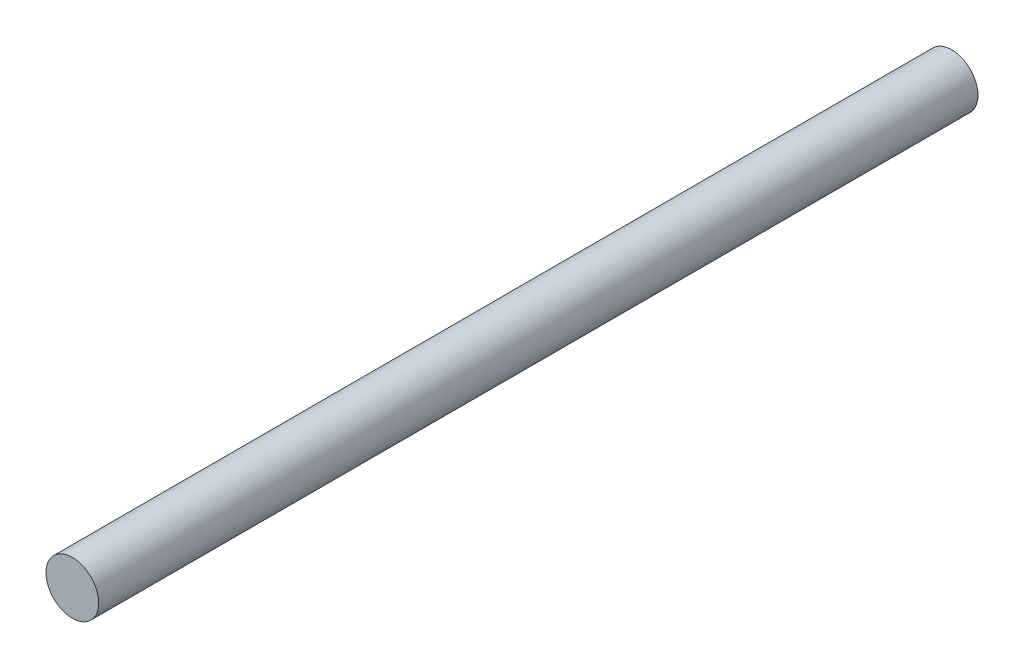
ISO-10303-21;
HEADER;
FILE_DESCRIPTION(('STEP AP214'),'2;1');
FILE_NAME('part.step','',(''),(''),'','','');
FILE_SCHEMA(('AUTOMOTIVE_DESIGN { 1 0 10303 214 1 1 1 1 }'));
ENDSEC;
DATA;
#1=APPLICATION_CONTEXT('core data for automotive mechanical design processes');
#2=APPLICATION_PROTOCOL_DEFINITION('international standard','automotive_design',2000,#1);
#3=PRODUCT_CONTEXT('',#1,'mechanical');
#4=PRODUCT('Part','Part','',(#3));
#5=PRODUCT_RELATED_PRODUCT_CATEGORY('part','',(#4));
#6=PRODUCT_DEFINITION_FORMATION('','',#4);
#7=PRODUCT_DEFINITION_CONTEXT('part definition',#1,'design');
#8=PRODUCT_DEFINITION('design','',#6,#7);
#9=PRODUCT_DEFINITION_SHAPE('','',#8);
#10=(LENGTH_UNIT() NAMED_UNIT(*) SI_UNIT(.MILLI.,.METRE.));
#11=(NAMED_UNIT(*) PLANE_ANGLE_UNIT() SI_UNIT($,.RADIAN.));
#12=(NAMED_UNIT(*) SI_UNIT($,.STERADIAN.) SOLID_ANGLE_UNIT());
#13=UNCERTAINTY_MEASURE_WITH_UNIT(LENGTH_MEASURE(1.E-05),#10,'distance_accuracy_value','');
#14=(GEOMETRIC_REPRESENTATION_CONTEXT(3) GLOBAL_UNCERTAINTY_ASSIGNED_CONTEXT((#13)) GLOBAL_UNIT_ASSIGNED_CONTEXT((#10,
#11,#12)) REPRESENTATION_CONTEXT('',''));
#15=CARTESIAN_POINT('',(0.,0.,0.));
#16=DIRECTION('',(0.,0.,1.));
#17=DIRECTION('',(1.,0.,0.));
#18=AXIS2_PLACEMENT_3D('',#15,#16,#17);
#19=CARTESIAN_POINT('',(0.,0.,1000.));
#20=DIRECTION('',(0.,0.,-1.));
#21=DIRECTION('',(-1.,0.,0.));
#22=AXIS2_PLACEMENT_3D('',#19,#20,#21);
#23=CYLINDRICAL_SURFACE('',#22,30.);
#24=CARTESIAN_POINT('',(0.,0.,1000.));
#25=DIRECTION('',(0.,0.,1.));
#26=DIRECTION('',(1.,0.,0.));
#27=AXIS2_PLACEMENT_3D('',#24,#25,#26);
#28=CIRCLE('',#27,30.);
#29=CARTESIAN_POINT('',(30.,0.,1000.));
#30=VERTEX_POINT('',#29);
#31=EDGE_CURVE('E10',#30,#30,#28,.T.);
#32=ORIENTED_EDGE('',*,*,#31,.F.);
#33=EDGE_LOOP('',(#32));
#34=FACE_BOUND('',#33,.T.);
#35=CARTESIAN_POINT('',(0.,0.,0.));
#36=DIRECTION('',(0.,0.,1.));
#37=DIRECTION('',(1.,0.,0.));
#38=AXIS2_PLACEMENT_3D('',#35,#36,#37);
#39=CIRCLE('',#38,30.);
#40=CARTESIAN_POINT('',(30.,0.,0.));
#41=VERTEX_POINT('',#40);
#42=EDGE_CURVE('E44',#41,#41,#39,.T.);
#43=ORIENTED_EDGE('',*,*,#42,.T.);
#44=EDGE_LOOP('',(#43));
#45=FACE_BOUND('',#44,.T.);
#46=ADVANCED_FACE('F41',(#34,#45),#23,.T.);
#47=CARTESIAN_POINT('',(0.,0.,1000.));
#48=DIRECTION('',(0.,0.,1.));
#49=DIRECTION('',(1.,0.,0.));
#50=AXIS2_PLACEMENT_3D('',#47,#48,#49);
#51=PLANE('',#50);
#52=ORIENTED_EDGE('',*,*,#31,.T.);
#53=EDGE_LOOP('',(#52));
#54=FACE_BOUND('',#53,.T.);
#55=ADVANCED_FACE('F58',(#54),#51,.T.);
#56=CARTESIAN_POINT('',(0.,0.,0.));
#57=DIRECTION('',(0.,0.,1.));
#58=DIRECTION('',(1.,0.,0.));
#59=AXIS2_PLACEMENT_3D('',#56,#57,#58);
#60=PLANE('',#59);
#61=ORIENTED_EDGE('',*,*,#42,.F.);
#62=EDGE_LOOP('',(#61));
#63=FACE_BOUND('',#62,.T.);
#64=ADVANCED_FACE('F56',(#63),#60,.F.);
#65=CLOSED_SHELL('',(#46,#55,#64));
#66=MANIFOLD_SOLID_BREP('B2',#65);
#67=ADVANCED_BREP_SHAPE_REPRESENTATION('',(#18,#66),#14);
#68=SHAPE_DEFINITION_REPRESENTATION(#9,#67);
ENDSEC;
END-ISO-10303-21;
